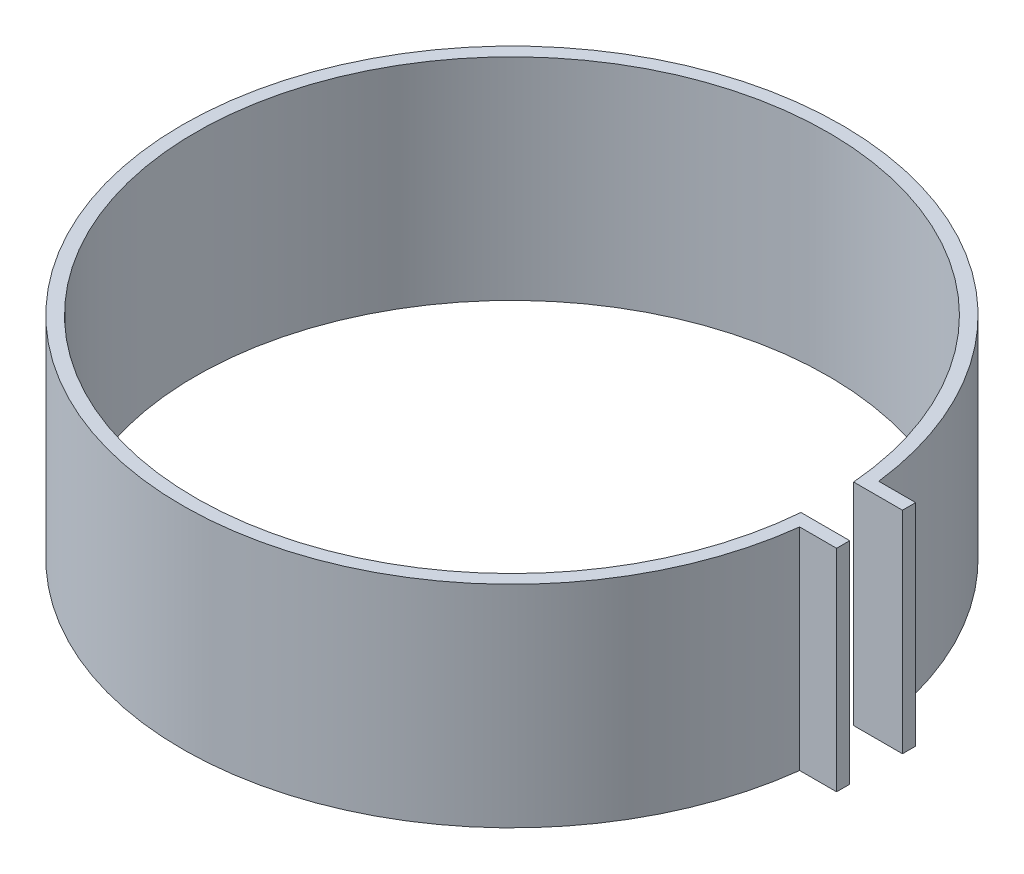
ISO-10303-21;
HEADER;
FILE_DESCRIPTION(('STEP AP214'),'2;1');
FILE_NAME('part.step','',(''),(''),'','','');
FILE_SCHEMA(('AUTOMOTIVE_DESIGN { 1 0 10303 214 1 1 1 1 }'));
ENDSEC;
DATA;
#1=APPLICATION_CONTEXT('core data for automotive mechanical design processes');
#2=APPLICATION_PROTOCOL_DEFINITION('international standard','automotive_design',2000,#1);
#3=PRODUCT_CONTEXT('',#1,'mechanical');
#4=PRODUCT('Part','Part','',(#3));
#5=PRODUCT_RELATED_PRODUCT_CATEGORY('part','',(#4));
#6=PRODUCT_DEFINITION_FORMATION('','',#4);
#7=PRODUCT_DEFINITION_CONTEXT('part definition',#1,'design');
#8=PRODUCT_DEFINITION('design','',#6,#7);
#9=PRODUCT_DEFINITION_SHAPE('','',#8);
#10=(LENGTH_UNIT() NAMED_UNIT(*) SI_UNIT(.MILLI.,.METRE.));
#11=(NAMED_UNIT(*) PLANE_ANGLE_UNIT() SI_UNIT($,.RADIAN.));
#12=(NAMED_UNIT(*) SI_UNIT($,.STERADIAN.) SOLID_ANGLE_UNIT());
#13=UNCERTAINTY_MEASURE_WITH_UNIT(LENGTH_MEASURE(1.E-05),#10,'distance_accuracy_value','');
#14=(GEOMETRIC_REPRESENTATION_CONTEXT(3) GLOBAL_UNCERTAINTY_ASSIGNED_CONTEXT((#13)) GLOBAL_UNIT_ASSIGNED_CONTEXT((#10,
#11,#12)) REPRESENTATION_CONTEXT('',''));
#15=CARTESIAN_POINT('',(0.,0.,0.));
#16=DIRECTION('',(0.,0.,1.));
#17=DIRECTION('',(1.,0.,0.));
#18=AXIS2_PLACEMENT_3D('',#15,#16,#17);
#19=CARTESIAN_POINT('',(0.,50.8,0.));
#20=DIRECTION('',(0.,-1.,0.));
#21=DIRECTION('',(0.,0.,-1.));
#22=AXIS2_PLACEMENT_3D('',#19,#20,#21);
#23=CYLINDRICAL_SURFACE('',#22,79.375);
#24=CARTESIAN_POINT('',(0.,0.,0.));
#25=DIRECTION('',(0.,1.,0.));
#26=DIRECTION('',(0.,0.,1.));
#27=AXIS2_PLACEMENT_3D('',#24,#25,#26);
#28=CIRCLE('',#27,79.375);
#29=CARTESIAN_POINT('',(78.8014276520419,0.,-9.525));
#30=VERTEX_POINT('',#29);
#31=CARTESIAN_POINT('',(78.8014276520419,0.,9.525));
#32=VERTEX_POINT('',#31);
#33=EDGE_CURVE('E144',#30,#32,#28,.T.);
#34=ORIENTED_EDGE('',*,*,#33,.T.);
#35=DIRECTION('',(0.,-1.,0.));
#36=VECTOR('',#35,1.);
#37=CARTESIAN_POINT('',(78.8014276520419,50.8,9.525));
#38=LINE('',#37,#36);
#39=CARTESIAN_POINT('',(78.8014276520419,50.8,9.525));
#40=VERTEX_POINT('',#39);
#41=EDGE_CURVE('E11',#40,#32,#38,.T.);
#42=ORIENTED_EDGE('',*,*,#41,.F.);
#43=CARTESIAN_POINT('',(0.,50.8,0.));
#44=DIRECTION('',(0.,1.,0.));
#45=DIRECTION('',(0.,0.,1.));
#46=AXIS2_PLACEMENT_3D('',#43,#44,#45);
#47=CIRCLE('',#46,79.375);
#48=CARTESIAN_POINT('',(78.8014276520419,50.8,-9.525));
#49=VERTEX_POINT('',#48);
#50=EDGE_CURVE('E168',#49,#40,#47,.T.);
#51=ORIENTED_EDGE('',*,*,#50,.F.);
#52=DIRECTION('',(0.,-1.,0.));
#53=VECTOR('',#52,1.);
#54=CARTESIAN_POINT('',(78.8014276520419,50.8,-9.525));
#55=LINE('',#54,#53);
#56=EDGE_CURVE('E140',#49,#30,#55,.T.);
#57=ORIENTED_EDGE('',*,*,#56,.T.);
#58=EDGE_LOOP('',(#34,#42,#51,#57));
#59=FACE_BOUND('',#58,.T.);
#60=ADVANCED_FACE('F39',(#59),#23,.T.);
#61=CARTESIAN_POINT('',(78.8014276520419,50.8,9.525));
#62=DIRECTION('',(0.,0.,-1.));
#63=DIRECTION('',(-1.,0.,0.));
#64=AXIS2_PLACEMENT_3D('',#61,#62,#63);
#65=PLANE('',#64);
#66=DIRECTION('',(1.,0.,0.));
#67=VECTOR('',#66,1.);
#68=CARTESIAN_POINT('',(78.8014276520419,0.,9.525));
#69=LINE('',#68,#67);
#70=CARTESIAN_POINT('',(87.6909503141161,0.,9.525));
#71=VERTEX_POINT('',#70);
#72=EDGE_CURVE('E148',#32,#71,#69,.T.);
#73=ORIENTED_EDGE('',*,*,#72,.T.);
#74=DIRECTION('',(0.,-1.,0.));
#75=VECTOR('',#74,1.);
#76=CARTESIAN_POINT('',(87.6909503141161,50.8,9.525));
#77=LINE('',#76,#75);
#78=CARTESIAN_POINT('',(87.6909503141161,50.8,9.525));
#79=VERTEX_POINT('',#78);
#80=EDGE_CURVE('E48',#79,#71,#77,.T.);
#81=ORIENTED_EDGE('',*,*,#80,.F.);
#82=DIRECTION('',(1.,0.,0.));
#83=VECTOR('',#82,1.);
#84=CARTESIAN_POINT('',(78.8014276520419,50.8,9.525));
#85=LINE('',#84,#83);
#86=EDGE_CURVE('E107',#40,#79,#85,.T.);
#87=ORIENTED_EDGE('',*,*,#86,.F.);
#88=ORIENTED_EDGE('',*,*,#41,.T.);
#89=EDGE_LOOP('',(#73,#81,#87,#88));
#90=FACE_BOUND('',#89,.T.);
#91=ADVANCED_FACE('F210',(#90),#65,.F.);
#92=CARTESIAN_POINT('',(87.6909503141161,50.8,6.35));
#93=DIRECTION('',(-1.,0.,0.));
#94=DIRECTION('',(0.,0.,1.));
#95=AXIS2_PLACEMENT_3D('',#92,#93,#94);
#96=PLANE('',#95);
#97=DIRECTION('',(0.,0.,-1.));
#98=VECTOR('',#97,1.);
#99=CARTESIAN_POINT('',(87.6909503141161,0.,6.35));
#100=LINE('',#99,#98);
#101=CARTESIAN_POINT('',(87.6909503141161,0.,6.35));
#102=VERTEX_POINT('',#101);
#103=EDGE_CURVE('E151',#71,#102,#100,.T.);
#104=ORIENTED_EDGE('',*,*,#103,.T.);
#105=DIRECTION('',(0.,-1.,0.));
#106=VECTOR('',#105,1.);
#107=CARTESIAN_POINT('',(87.6909503141161,50.8,6.35));
#108=LINE('',#107,#106);
#109=CARTESIAN_POINT('',(87.6909503141161,50.8,6.35));
#110=VERTEX_POINT('',#109);
#111=EDGE_CURVE('E179',#110,#102,#108,.T.);
#112=ORIENTED_EDGE('',*,*,#111,.F.);
#113=DIRECTION('',(0.,0.,-1.));
#114=VECTOR('',#113,1.);
#115=CARTESIAN_POINT('',(87.6909503141161,50.8,6.35));
#116=LINE('',#115,#114);
#117=EDGE_CURVE('E189',#79,#110,#116,.T.);
#118=ORIENTED_EDGE('',*,*,#117,.F.);
#119=ORIENTED_EDGE('',*,*,#80,.T.);
#120=EDGE_LOOP('',(#104,#112,#118,#119));
#121=FACE_BOUND('',#120,.T.);
#122=ADVANCED_FACE('F187',(#121),#96,.F.);
#123=CARTESIAN_POINT('',(78.8009503141161,50.8,6.35));
#124=DIRECTION('',(0.,0.,1.));
#125=DIRECTION('',(1.,0.,0.));
#126=AXIS2_PLACEMENT_3D('',#123,#124,#125);
#127=PLANE('',#126);
#128=DIRECTION('',(-1.,0.,0.));
#129=VECTOR('',#128,1.);
#130=CARTESIAN_POINT('',(78.8009503141161,0.,6.35));
#131=LINE('',#130,#129);
#132=CARTESIAN_POINT('',(75.9349557186939,0.,6.35000000000004));
#133=VERTEX_POINT('',#132);
#134=EDGE_CURVE('E155',#102,#133,#131,.T.);
#135=ORIENTED_EDGE('',*,*,#134,.T.);
#136=DIRECTION('',(0.,-1.,0.));
#137=VECTOR('',#136,1.);
#138=CARTESIAN_POINT('',(75.9349557186939,50.8,6.35000000000004));
#139=LINE('',#138,#137);
#140=CARTESIAN_POINT('',(75.9349557186939,50.8,6.35000000000004));
#141=VERTEX_POINT('',#140);
#142=EDGE_CURVE('E175',#141,#133,#139,.T.);
#143=ORIENTED_EDGE('',*,*,#142,.F.);
#144=DIRECTION('',(-1.,0.,0.));
#145=VECTOR('',#144,1.);
#146=CARTESIAN_POINT('',(78.8009503141161,50.8,6.35));
#147=LINE('',#146,#145);
#148=EDGE_CURVE('E201',#110,#141,#147,.T.);
#149=ORIENTED_EDGE('',*,*,#148,.F.);
#150=ORIENTED_EDGE('',*,*,#111,.T.);
#151=EDGE_LOOP('',(#135,#143,#149,#150));
#152=FACE_BOUND('',#151,.T.);
#153=ADVANCED_FACE('F196',(#152),#127,.F.);
#154=CARTESIAN_POINT('',(0.,50.8,0.));
#155=DIRECTION('',(0.,-1.,0.));
#156=DIRECTION('',(0.,0.,-1.));
#157=AXIS2_PLACEMENT_3D('',#154,#155,#156);
#158=CYLINDRICAL_SURFACE('',#157,76.2);
#159=CARTESIAN_POINT('',(0.,0.,0.));
#160=DIRECTION('',(0.,-1.,0.));
#161=DIRECTION('',(0.,0.,1.));
#162=AXIS2_PLACEMENT_3D('',#159,#160,#161);
#163=CIRCLE('',#162,76.2);
#164=CARTESIAN_POINT('',(75.9349557186939,0.,-6.35));
#165=VERTEX_POINT('',#164);
#166=EDGE_CURVE('E158',#133,#165,#163,.T.);
#167=ORIENTED_EDGE('',*,*,#166,.T.);
#168=DIRECTION('',(0.,-1.,0.));
#169=VECTOR('',#168,1.);
#170=CARTESIAN_POINT('',(75.9349557186939,50.8,-6.35));
#171=LINE('',#170,#169);
#172=CARTESIAN_POINT('',(75.9349557186939,50.8,-6.35));
#173=VERTEX_POINT('',#172);
#174=EDGE_CURVE('E135',#173,#165,#171,.T.);
#175=ORIENTED_EDGE('',*,*,#174,.F.);
#176=CARTESIAN_POINT('',(0.,50.8,0.));
#177=DIRECTION('',(0.,-1.,0.));
#178=DIRECTION('',(0.,0.,1.));
#179=AXIS2_PLACEMENT_3D('',#176,#177,#178);
#180=CIRCLE('',#179,76.2);
#181=EDGE_CURVE('E126',#141,#173,#180,.T.);
#182=ORIENTED_EDGE('',*,*,#181,.F.);
#183=ORIENTED_EDGE('',*,*,#142,.T.);
#184=EDGE_LOOP('',(#167,#175,#182,#183));
#185=FACE_BOUND('',#184,.T.);
#186=ADVANCED_FACE('F199',(#185),#158,.F.);
#187=CARTESIAN_POINT('',(78.8009503141161,50.8,-6.35));
#188=DIRECTION('',(0.,0.,-1.));
#189=DIRECTION('',(-1.,0.,0.));
#190=AXIS2_PLACEMENT_3D('',#187,#188,#189);
#191=PLANE('',#190);
#192=DIRECTION('',(1.,0.,0.));
#193=VECTOR('',#192,1.);
#194=CARTESIAN_POINT('',(78.8009503141161,0.,-6.35));
#195=LINE('',#194,#193);
#196=CARTESIAN_POINT('',(87.6909503141161,0.,-6.35));
#197=VERTEX_POINT('',#196);
#198=EDGE_CURVE('E133',#165,#197,#195,.T.);
#199=ORIENTED_EDGE('',*,*,#198,.T.);
#200=DIRECTION('',(0.,-1.,0.));
#201=VECTOR('',#200,1.);
#202=CARTESIAN_POINT('',(87.6909503141161,50.8,-6.35));
#203=LINE('',#202,#201);
#204=CARTESIAN_POINT('',(87.6909503141161,50.8,-6.35));
#205=VERTEX_POINT('',#204);
#206=EDGE_CURVE('E131',#205,#197,#203,.T.);
#207=ORIENTED_EDGE('',*,*,#206,.F.);
#208=DIRECTION('',(1.,0.,0.));
#209=VECTOR('',#208,1.);
#210=CARTESIAN_POINT('',(78.8009503141161,50.8,-6.35));
#211=LINE('',#210,#209);
#212=EDGE_CURVE('E120',#173,#205,#211,.T.);
#213=ORIENTED_EDGE('',*,*,#212,.F.);
#214=ORIENTED_EDGE('',*,*,#174,.T.);
#215=EDGE_LOOP('',(#199,#207,#213,#214));
#216=FACE_BOUND('',#215,.T.);
#217=ADVANCED_FACE('F132',(#216),#191,.F.);
#218=CARTESIAN_POINT('',(87.6909503141161,50.8,-9.525));
#219=DIRECTION('',(-1.,0.,0.));
#220=DIRECTION('',(0.,0.,1.));
#221=AXIS2_PLACEMENT_3D('',#218,#219,#220);
#222=PLANE('',#221);
#223=DIRECTION('',(0.,0.,-1.));
#224=VECTOR('',#223,1.);
#225=CARTESIAN_POINT('',(87.6909503141161,0.,-9.525));
#226=LINE('',#225,#224);
#227=CARTESIAN_POINT('',(87.6909503141161,0.,-9.525));
#228=VERTEX_POINT('',#227);
#229=EDGE_CURVE('E92',#197,#228,#226,.T.);
#230=ORIENTED_EDGE('',*,*,#229,.T.);
#231=DIRECTION('',(0.,-1.,0.));
#232=VECTOR('',#231,1.);
#233=CARTESIAN_POINT('',(87.6909503141161,50.8,-9.525));
#234=LINE('',#233,#232);
#235=CARTESIAN_POINT('',(87.6909503141161,50.8,-9.525));
#236=VERTEX_POINT('',#235);
#237=EDGE_CURVE('E136',#236,#228,#234,.T.);
#238=ORIENTED_EDGE('',*,*,#237,.F.);
#239=DIRECTION('',(0.,0.,-1.));
#240=VECTOR('',#239,1.);
#241=CARTESIAN_POINT('',(87.6909503141161,50.8,-9.525));
#242=LINE('',#241,#240);
#243=EDGE_CURVE('E124',#205,#236,#242,.T.);
#244=ORIENTED_EDGE('',*,*,#243,.F.);
#245=ORIENTED_EDGE('',*,*,#206,.T.);
#246=EDGE_LOOP('',(#230,#238,#244,#245));
#247=FACE_BOUND('',#246,.T.);
#248=ADVANCED_FACE('F138',(#247),#222,.F.);
#249=CARTESIAN_POINT('',(78.8014276520419,50.8,-9.525));
#250=DIRECTION('',(0.,0.,1.));
#251=DIRECTION('',(1.,0.,0.));
#252=AXIS2_PLACEMENT_3D('',#249,#250,#251);
#253=PLANE('',#252);
#254=DIRECTION('',(-1.,0.,0.));
#255=VECTOR('',#254,1.);
#256=CARTESIAN_POINT('',(78.8014276520419,0.,-9.525));
#257=LINE('',#256,#255);
#258=EDGE_CURVE('E99',#228,#30,#257,.T.);
#259=ORIENTED_EDGE('',*,*,#258,.T.);
#260=ORIENTED_EDGE('',*,*,#56,.F.);
#261=DIRECTION('',(-1.,0.,0.));
#262=VECTOR('',#261,1.);
#263=CARTESIAN_POINT('',(78.8014276520419,50.8,-9.525));
#264=LINE('',#263,#262);
#265=EDGE_CURVE('E56',#236,#49,#264,.T.);
#266=ORIENTED_EDGE('',*,*,#265,.F.);
#267=ORIENTED_EDGE('',*,*,#237,.T.);
#268=EDGE_LOOP('',(#259,#260,#266,#267));
#269=FACE_BOUND('',#268,.T.);
#270=ADVANCED_FACE('F226',(#269),#253,.F.);
#271=CARTESIAN_POINT('',(0.,50.8,0.));
#272=DIRECTION('',(0.,1.,0.));
#273=DIRECTION('',(0.,0.,1.));
#274=AXIS2_PLACEMENT_3D('',#271,#272,#273);
#275=PLANE('',#274);
#276=ORIENTED_EDGE('',*,*,#50,.T.);
#277=ORIENTED_EDGE('',*,*,#86,.T.);
#278=ORIENTED_EDGE('',*,*,#117,.T.);
#279=ORIENTED_EDGE('',*,*,#148,.T.);
#280=ORIENTED_EDGE('',*,*,#181,.T.);
#281=ORIENTED_EDGE('',*,*,#212,.T.);
#282=ORIENTED_EDGE('',*,*,#243,.T.);
#283=ORIENTED_EDGE('',*,*,#265,.T.);
#284=EDGE_LOOP('',(#276,#277,#278,#279,#280,#281,#282,#283));
#285=FACE_BOUND('',#284,.T.);
#286=ADVANCED_FACE('F122',(#285),#275,.T.);
#287=CARTESIAN_POINT('',(0.,0.,0.));
#288=DIRECTION('',(0.,1.,0.));
#289=DIRECTION('',(0.,0.,1.));
#290=AXIS2_PLACEMENT_3D('',#287,#288,#289);
#291=PLANE('',#290);
#292=ORIENTED_EDGE('',*,*,#33,.F.);
#293=ORIENTED_EDGE('',*,*,#258,.F.);
#294=ORIENTED_EDGE('',*,*,#229,.F.);
#295=ORIENTED_EDGE('',*,*,#198,.F.);
#296=ORIENTED_EDGE('',*,*,#166,.F.);
#297=ORIENTED_EDGE('',*,*,#134,.F.);
#298=ORIENTED_EDGE('',*,*,#103,.F.);
#299=ORIENTED_EDGE('',*,*,#72,.F.);
#300=EDGE_LOOP('',(#292,#293,#294,#295,#296,#297,#298,#299));
#301=FACE_BOUND('',#300,.T.);
#302=ADVANCED_FACE('F192',(#301),#291,.F.);
#303=CLOSED_SHELL('',(#60,#91,#122,#153,#186,#217,#248,#270,#286,#302));
#304=MANIFOLD_SOLID_BREP('B2',#303);
#305=ADVANCED_BREP_SHAPE_REPRESENTATION('',(#18,#304),#14);
#306=SHAPE_DEFINITION_REPRESENTATION(#9,#305);
ENDSEC;
END-ISO-10303-21;
